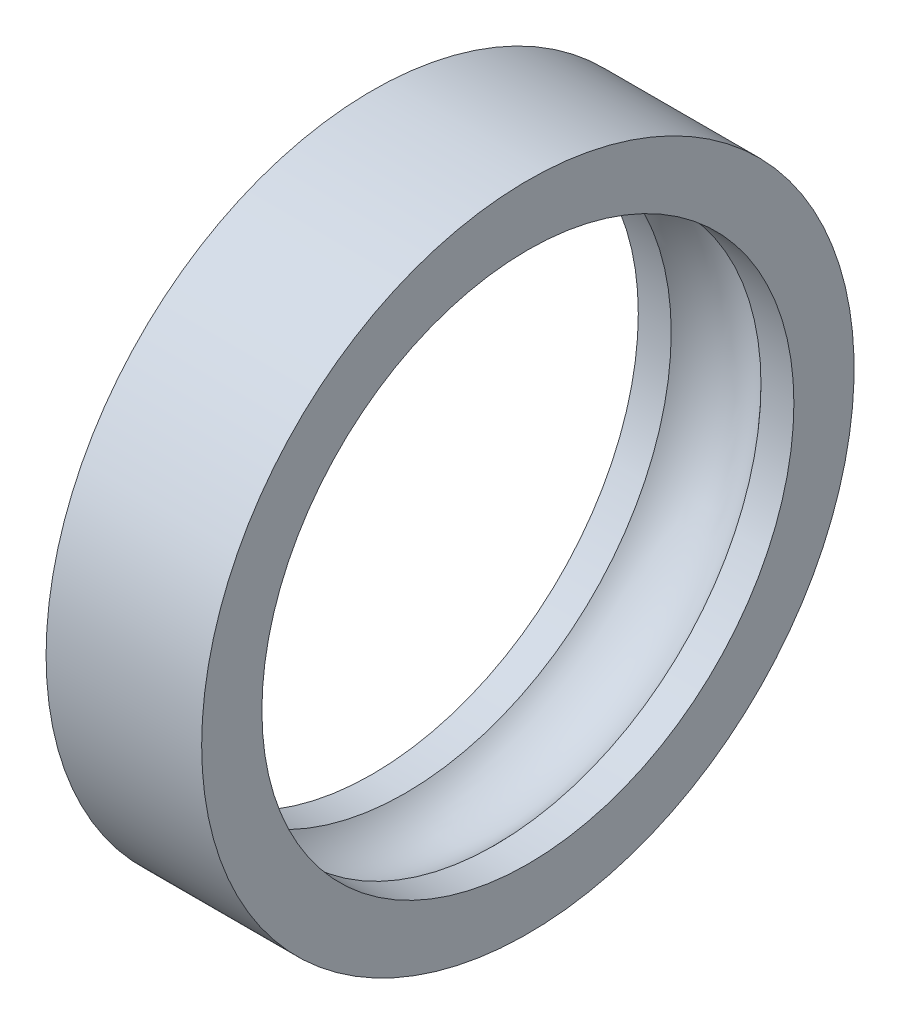
ISO-10303-21;
HEADER;
FILE_DESCRIPTION(('STEP AP214'),'2;1');
FILE_NAME('part.step','',(''),(''),'','','');
FILE_SCHEMA(('AUTOMOTIVE_DESIGN { 1 0 10303 214 1 1 1 1 }'));
ENDSEC;
DATA;
#1=APPLICATION_CONTEXT('core data for automotive mechanical design processes');
#2=APPLICATION_PROTOCOL_DEFINITION('international standard','automotive_design',2000,#1);
#3=PRODUCT_CONTEXT('',#1,'mechanical');
#4=PRODUCT('Part','Part','',(#3));
#5=PRODUCT_RELATED_PRODUCT_CATEGORY('part','',(#4));
#6=PRODUCT_DEFINITION_FORMATION('','',#4);
#7=PRODUCT_DEFINITION_CONTEXT('part definition',#1,'design');
#8=PRODUCT_DEFINITION('design','',#6,#7);
#9=PRODUCT_DEFINITION_SHAPE('','',#8);
#10=(LENGTH_UNIT() NAMED_UNIT(*) SI_UNIT(.MILLI.,.METRE.));
#11=(NAMED_UNIT(*) PLANE_ANGLE_UNIT() SI_UNIT($,.RADIAN.));
#12=(NAMED_UNIT(*) SI_UNIT($,.STERADIAN.) SOLID_ANGLE_UNIT());
#13=UNCERTAINTY_MEASURE_WITH_UNIT(LENGTH_MEASURE(1.E-05),#10,'distance_accuracy_value','');
#14=(GEOMETRIC_REPRESENTATION_CONTEXT(3) GLOBAL_UNCERTAINTY_ASSIGNED_CONTEXT((#13)) GLOBAL_UNIT_ASSIGNED_CONTEXT((#10,
#11,#12)) REPRESENTATION_CONTEXT('',''));
#15=CARTESIAN_POINT('',(0.,0.,0.));
#16=DIRECTION('',(0.,0.,1.));
#17=DIRECTION('',(1.,0.,0.));
#18=AXIS2_PLACEMENT_3D('',#15,#16,#17);
#19=CARTESIAN_POINT('',(-30.2521929824561,-52.9331140350877,0.));
#20=DIRECTION('',(-1.,0.,0.));
#21=DIRECTION('',(0.,0.,1.));
#22=AXIS2_PLACEMENT_3D('',#19,#20,#21);
#23=CYLINDRICAL_SURFACE('',#22,53.);
#24=CARTESIAN_POINT('',(8.29385964912281,-52.9331140350877,0.));
#25=DIRECTION('',(-1.,0.,0.));
#26=DIRECTION('',(0.,0.,1.));
#27=AXIS2_PLACEMENT_3D('',#24,#25,#26);
#28=CIRCLE('',#27,53.);
#29=CARTESIAN_POINT('',(8.29385964912281,-52.9331140350877,53.));
#30=VERTEX_POINT('',#29);
#31=EDGE_CURVE('E53',#30,#30,#28,.T.);
#32=ORIENTED_EDGE('',*,*,#31,.F.);
#33=EDGE_LOOP('',(#32));
#34=FACE_BOUND('',#33,.T.);
#35=CARTESIAN_POINT('',(1.73813155912196,-52.9331140350877,0.));
#36=DIRECTION('',(-1.,0.,0.));
#37=DIRECTION('',(0.,0.,1.));
#38=AXIS2_PLACEMENT_3D('',#35,#36,#37);
#39=CIRCLE('',#38,53.);
#40=CARTESIAN_POINT('',(1.73813155912196,-52.9331140350877,53.));
#41=VERTEX_POINT('',#40);
#42=EDGE_CURVE('E10',#41,#41,#39,.T.);
#43=ORIENTED_EDGE('',*,*,#42,.T.);
#44=EDGE_LOOP('',(#43));
#45=FACE_BOUND('',#44,.T.);
#46=ADVANCED_FACE('F31',(#34,#45),#23,.F.);
#47=CARTESIAN_POINT('',(-7.2061403508772,-52.9331140350877,0.));
#48=DIRECTION('',(-1.,0.,0.));
#49=DIRECTION('',(0.,0.,1.));
#50=AXIS2_PLACEMENT_3D('',#47,#48,#49);
#51=TOROIDAL_SURFACE('',#50,45.,12.);
#52=ORIENTED_EDGE('',*,*,#42,.F.);
#53=EDGE_LOOP('',(#52));
#54=FACE_BOUND('',#53,.T.);
#55=CARTESIAN_POINT('',(-16.1504122608764,-52.9331140350877,0.));
#56=DIRECTION('',(-1.,0.,0.));
#57=DIRECTION('',(0.,0.,1.));
#58=AXIS2_PLACEMENT_3D('',#55,#56,#57);
#59=CIRCLE('',#58,53.);
#60=CARTESIAN_POINT('',(-16.1504122608764,-52.9331140350877,53.));
#61=VERTEX_POINT('',#60);
#62=EDGE_CURVE('E37',#61,#61,#59,.T.);
#63=ORIENTED_EDGE('',*,*,#62,.T.);
#64=EDGE_LOOP('',(#63));
#65=FACE_BOUND('',#64,.T.);
#66=ADVANCED_FACE('F60',(#54,#65),#51,.F.);
#67=CARTESIAN_POINT('',(-30.2521929824561,-52.9331140350877,0.));
#68=DIRECTION('',(-1.,0.,0.));
#69=DIRECTION('',(0.,0.,1.));
#70=AXIS2_PLACEMENT_3D('',#67,#68,#69);
#71=CYLINDRICAL_SURFACE('',#70,53.);
#72=ORIENTED_EDGE('',*,*,#62,.F.);
#73=EDGE_LOOP('',(#72));
#74=FACE_BOUND('',#73,.T.);
#75=CARTESIAN_POINT('',(-22.7061403508772,-52.9331140350877,0.));
#76=DIRECTION('',(-1.,0.,0.));
#77=DIRECTION('',(0.,0.,1.));
#78=AXIS2_PLACEMENT_3D('',#75,#76,#77);
#79=CIRCLE('',#78,53.);
#80=CARTESIAN_POINT('',(-22.7061403508772,-52.9331140350877,53.));
#81=VERTEX_POINT('',#80);
#82=EDGE_CURVE('E41',#81,#81,#79,.T.);
#83=ORIENTED_EDGE('',*,*,#82,.T.);
#84=EDGE_LOOP('',(#83));
#85=FACE_BOUND('',#84,.T.);
#86=ADVANCED_FACE('F64',(#74,#85),#71,.F.);
#87=CARTESIAN_POINT('',(-22.7061403508772,12.0668859649123,0.));
#88=DIRECTION('',(1.,0.,0.));
#89=DIRECTION('',(0.,0.,-1.));
#90=AXIS2_PLACEMENT_3D('',#87,#88,#89);
#91=PLANE('',#90);
#92=ORIENTED_EDGE('',*,*,#82,.F.);
#93=EDGE_LOOP('',(#92));
#94=FACE_BOUND('',#93,.T.);
#95=CARTESIAN_POINT('',(-22.7061403508772,-52.9331140350877,0.));
#96=DIRECTION('',(-1.,0.,0.));
#97=DIRECTION('',(0.,0.,1.));
#98=AXIS2_PLACEMENT_3D('',#95,#96,#97);
#99=CIRCLE('',#98,65.);
#100=CARTESIAN_POINT('',(-22.7061403508772,-52.9331140350877,65.));
#101=VERTEX_POINT('',#100);
#102=EDGE_CURVE('E45',#101,#101,#99,.T.);
#103=ORIENTED_EDGE('',*,*,#102,.T.);
#104=EDGE_LOOP('',(#103));
#105=FACE_BOUND('',#104,.T.);
#106=ADVANCED_FACE('F69',(#94,#105),#91,.F.);
#107=CARTESIAN_POINT('',(-30.2521929824561,-52.9331140350877,0.));
#108=DIRECTION('',(-1.,0.,0.));
#109=DIRECTION('',(0.,0.,1.));
#110=AXIS2_PLACEMENT_3D('',#107,#108,#109);
#111=CYLINDRICAL_SURFACE('',#110,65.);
#112=ORIENTED_EDGE('',*,*,#102,.F.);
#113=EDGE_LOOP('',(#112));
#114=FACE_BOUND('',#113,.T.);
#115=CARTESIAN_POINT('',(8.29385964912281,-52.9331140350877,0.));
#116=DIRECTION('',(-1.,0.,0.));
#117=DIRECTION('',(0.,0.,1.));
#118=AXIS2_PLACEMENT_3D('',#115,#116,#117);
#119=CIRCLE('',#118,65.);
#120=CARTESIAN_POINT('',(8.29385964912281,-52.9331140350877,65.));
#121=VERTEX_POINT('',#120);
#122=EDGE_CURVE('E50',#121,#121,#119,.T.);
#123=ORIENTED_EDGE('',*,*,#122,.T.);
#124=EDGE_LOOP('',(#123));
#125=FACE_BOUND('',#124,.T.);
#126=ADVANCED_FACE('F75',(#114,#125),#111,.T.);
#127=CARTESIAN_POINT('',(8.29385964912281,12.0668859649123,0.));
#128=DIRECTION('',(-1.,0.,0.));
#129=DIRECTION('',(0.,0.,1.));
#130=AXIS2_PLACEMENT_3D('',#127,#128,#129);
#131=PLANE('',#130);
#132=ORIENTED_EDGE('',*,*,#122,.F.);
#133=EDGE_LOOP('',(#132));
#134=FACE_BOUND('',#133,.T.);
#135=ORIENTED_EDGE('',*,*,#31,.T.);
#136=EDGE_LOOP('',(#135));
#137=FACE_BOUND('',#136,.T.);
#138=ADVANCED_FACE('F57',(#134,#137),#131,.F.);
#139=CLOSED_SHELL('',(#46,#66,#86,#106,#126,#138));
#140=MANIFOLD_SOLID_BREP('B2',#139);
#141=ADVANCED_BREP_SHAPE_REPRESENTATION('',(#18,#140),#14);
#142=SHAPE_DEFINITION_REPRESENTATION(#9,#141);
ENDSEC;
END-ISO-10303-21;
